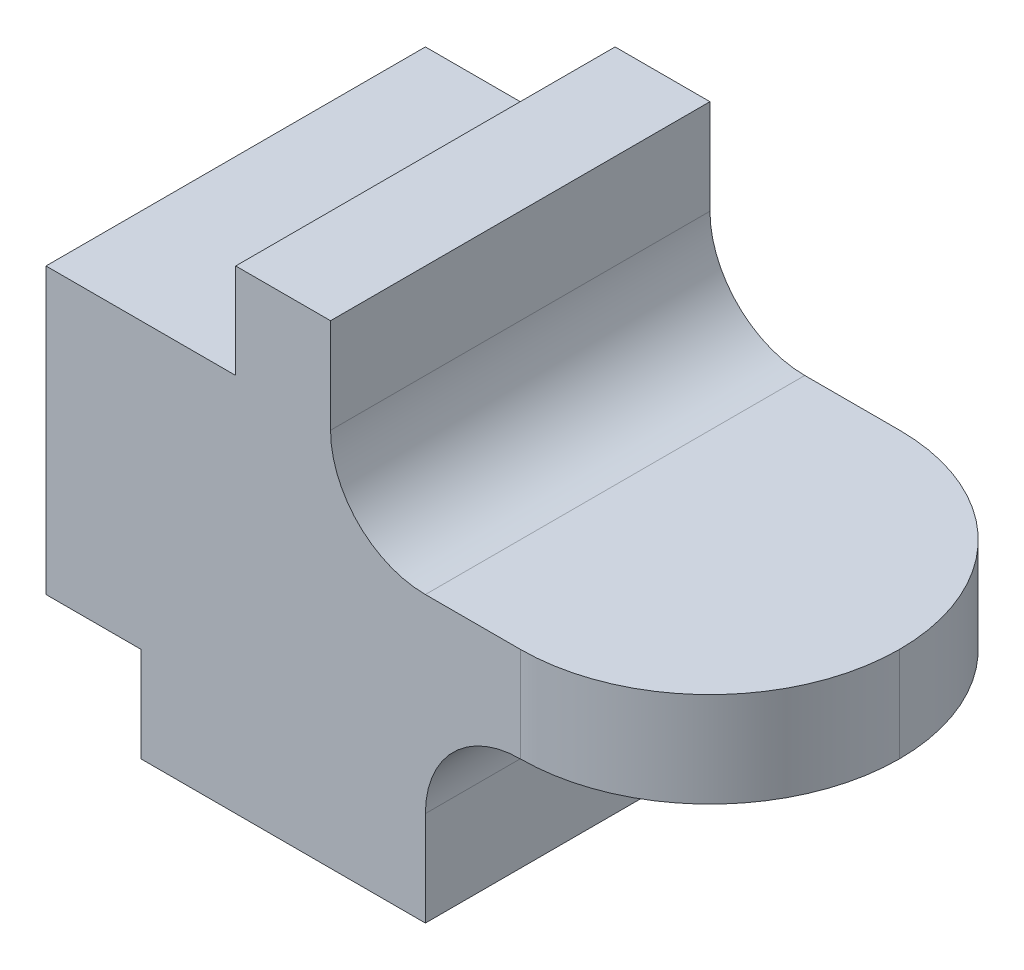
ISO-10303-21;
HEADER;
FILE_DESCRIPTION(('STEP AP214'),'2;1');
FILE_NAME('part.step','',(''),(''),'','','');
FILE_SCHEMA(('AUTOMOTIVE_DESIGN { 1 0 10303 214 1 1 1 1 }'));
ENDSEC;
DATA;
#1=APPLICATION_CONTEXT('core data for automotive mechanical design processes');
#2=APPLICATION_PROTOCOL_DEFINITION('international standard','automotive_design',2000,#1);
#3=PRODUCT_CONTEXT('',#1,'mechanical');
#4=PRODUCT('Part','Part','',(#3));
#5=PRODUCT_RELATED_PRODUCT_CATEGORY('part','',(#4));
#6=PRODUCT_DEFINITION_FORMATION('','',#4);
#7=PRODUCT_DEFINITION_CONTEXT('part definition',#1,'design');
#8=PRODUCT_DEFINITION('design','',#6,#7);
#9=PRODUCT_DEFINITION_SHAPE('','',#8);
#10=(LENGTH_UNIT() NAMED_UNIT(*) SI_UNIT(.MILLI.,.METRE.));
#11=(NAMED_UNIT(*) PLANE_ANGLE_UNIT() SI_UNIT($,.RADIAN.));
#12=(NAMED_UNIT(*) SI_UNIT($,.STERADIAN.) SOLID_ANGLE_UNIT());
#13=UNCERTAINTY_MEASURE_WITH_UNIT(LENGTH_MEASURE(1.E-05),#10,'distance_accuracy_value','');
#14=(GEOMETRIC_REPRESENTATION_CONTEXT(3) GLOBAL_UNCERTAINTY_ASSIGNED_CONTEXT((#13)) GLOBAL_UNIT_ASSIGNED_CONTEXT((#10,
#11,#12)) REPRESENTATION_CONTEXT('',''));
#15=CARTESIAN_POINT('',(0.,0.,0.));
#16=DIRECTION('',(0.,0.,1.));
#17=DIRECTION('',(1.,0.,0.));
#18=AXIS2_PLACEMENT_3D('',#15,#16,#17);
#19=CARTESIAN_POINT('',(5.,0.,20.));
#20=DIRECTION('',(0.,1.,0.));
#21=DIRECTION('',(-1.,0.,0.));
#22=AXIS2_PLACEMENT_3D('',#19,#20,#21);
#23=PLANE('',#22);
#24=DIRECTION('',(1.,0.,0.));
#25=VECTOR('',#24,1.);
#26=CARTESIAN_POINT('',(5.,0.,0.));
#27=LINE('',#26,#25);
#28=CARTESIAN_POINT('',(0.,0.,0.));
#29=VERTEX_POINT('',#28);
#30=CARTESIAN_POINT('',(5.,0.,0.));
#31=VERTEX_POINT('',#30);
#32=EDGE_CURVE('E158',#29,#31,#27,.T.);
#33=ORIENTED_EDGE('',*,*,#32,.T.);
#34=DIRECTION('',(0.,0.,-1.));
#35=VECTOR('',#34,1.);
#36=CARTESIAN_POINT('',(5.,0.,20.));
#37=LINE('',#36,#35);
#38=CARTESIAN_POINT('',(5.,0.,20.));
#39=VERTEX_POINT('',#38);
#40=EDGE_CURVE('E138',#39,#31,#37,.T.);
#41=ORIENTED_EDGE('',*,*,#40,.F.);
#42=DIRECTION('',(1.,0.,0.));
#43=VECTOR('',#42,1.);
#44=CARTESIAN_POINT('',(5.,0.,20.));
#45=LINE('',#44,#43);
#46=CARTESIAN_POINT('',(0.,0.,20.));
#47=VERTEX_POINT('',#46);
#48=EDGE_CURVE('E145',#47,#39,#45,.T.);
#49=ORIENTED_EDGE('',*,*,#48,.F.);
#50=DIRECTION('',(0.,0.,-1.));
#51=VECTOR('',#50,1.);
#52=CARTESIAN_POINT('',(0.,0.,20.));
#53=LINE('',#52,#51);
#54=EDGE_CURVE('E236',#47,#29,#53,.T.);
#55=ORIENTED_EDGE('',*,*,#54,.T.);
#56=EDGE_LOOP('',(#33,#41,#49,#55));
#57=FACE_BOUND('',#56,.T.);
#58=ADVANCED_FACE('F33',(#57),#23,.F.);
#59=CARTESIAN_POINT('',(5.,-5.,20.));
#60=DIRECTION('',(1.,0.,0.));
#61=DIRECTION('',(0.,0.,-1.));
#62=AXIS2_PLACEMENT_3D('',#59,#60,#61);
#63=PLANE('',#62);
#64=DIRECTION('',(0.,-1.,0.));
#65=VECTOR('',#64,1.);
#66=CARTESIAN_POINT('',(5.,-5.,0.));
#67=LINE('',#66,#65);
#68=CARTESIAN_POINT('',(5.,-5.,0.));
#69=VERTEX_POINT('',#68);
#70=EDGE_CURVE('E224',#31,#69,#67,.T.);
#71=ORIENTED_EDGE('',*,*,#70,.T.);
#72=DIRECTION('',(0.,0.,-1.));
#73=VECTOR('',#72,1.);
#74=CARTESIAN_POINT('',(5.,-5.,20.));
#75=LINE('',#74,#73);
#76=CARTESIAN_POINT('',(5.,-5.,20.));
#77=VERTEX_POINT('',#76);
#78=EDGE_CURVE('E141',#77,#69,#75,.T.);
#79=ORIENTED_EDGE('',*,*,#78,.F.);
#80=DIRECTION('',(0.,-1.,0.));
#81=VECTOR('',#80,1.);
#82=CARTESIAN_POINT('',(5.,-5.,20.));
#83=LINE('',#82,#81);
#84=EDGE_CURVE('E134',#39,#77,#83,.T.);
#85=ORIENTED_EDGE('',*,*,#84,.F.);
#86=ORIENTED_EDGE('',*,*,#40,.T.);
#87=EDGE_LOOP('',(#71,#79,#85,#86));
#88=FACE_BOUND('',#87,.T.);
#89=ADVANCED_FACE('F136',(#88),#63,.F.);
#90=CARTESIAN_POINT('',(20.,-5.,20.));
#91=DIRECTION('',(0.,1.,0.));
#92=DIRECTION('',(-1.,0.,0.));
#93=AXIS2_PLACEMENT_3D('',#90,#91,#92);
#94=PLANE('',#93);
#95=DIRECTION('',(1.,0.,0.));
#96=VECTOR('',#95,1.);
#97=CARTESIAN_POINT('',(20.,-5.,0.));
#98=LINE('',#97,#96);
#99=CARTESIAN_POINT('',(20.,-5.,0.));
#100=VERTEX_POINT('',#99);
#101=EDGE_CURVE('E220',#69,#100,#98,.T.);
#102=ORIENTED_EDGE('',*,*,#101,.T.);
#103=DIRECTION('',(0.,0.,-1.));
#104=VECTOR('',#103,1.);
#105=CARTESIAN_POINT('',(20.,-5.,20.));
#106=LINE('',#105,#104);
#107=CARTESIAN_POINT('',(20.,-5.,20.));
#108=VERTEX_POINT('',#107);
#109=EDGE_CURVE('E163',#108,#100,#106,.T.);
#110=ORIENTED_EDGE('',*,*,#109,.F.);
#111=DIRECTION('',(1.,0.,0.));
#112=VECTOR('',#111,1.);
#113=CARTESIAN_POINT('',(20.,-5.,20.));
#114=LINE('',#113,#112);
#115=EDGE_CURVE('E144',#77,#108,#114,.T.);
#116=ORIENTED_EDGE('',*,*,#115,.F.);
#117=ORIENTED_EDGE('',*,*,#78,.T.);
#118=EDGE_LOOP('',(#102,#110,#116,#117));
#119=FACE_BOUND('',#118,.T.);
#120=ADVANCED_FACE('F277',(#119),#94,.F.);
#121=CARTESIAN_POINT('',(20.,5.,20.));
#122=DIRECTION('',(-1.,0.,0.));
#123=DIRECTION('',(0.,0.,1.));
#124=AXIS2_PLACEMENT_3D('',#121,#122,#123);
#125=PLANE('',#124);
#126=DIRECTION('',(0.,1.,0.));
#127=VECTOR('',#126,1.);
#128=CARTESIAN_POINT('',(20.,5.,0.));
#129=LINE('',#128,#127);
#130=CARTESIAN_POINT('',(20.,0.,0.));
#131=VERTEX_POINT('',#130);
#132=EDGE_CURVE('E213',#100,#131,#129,.T.);
#133=ORIENTED_EDGE('',*,*,#132,.T.);
#134=DIRECTION('',(0.,0.,-1.));
#135=VECTOR('',#134,1.);
#136=CARTESIAN_POINT('',(20.,0.,20.));
#137=LINE('',#136,#135);
#138=CARTESIAN_POINT('',(20.,0.,20.));
#139=VERTEX_POINT('',#138);
#140=EDGE_CURVE('E184',#131,#139,#137,.F.);
#141=ORIENTED_EDGE('',*,*,#140,.T.);
#142=DIRECTION('',(0.,1.,0.));
#143=VECTOR('',#142,1.);
#144=CARTESIAN_POINT('',(20.,5.,20.));
#145=LINE('',#144,#143);
#146=EDGE_CURVE('E196',#108,#139,#145,.T.);
#147=ORIENTED_EDGE('',*,*,#146,.F.);
#148=ORIENTED_EDGE('',*,*,#109,.T.);
#149=EDGE_LOOP('',(#133,#141,#147,#148));
#150=FACE_BOUND('',#149,.T.);
#151=ADVANCED_FACE('F217',(#150),#125,.F.);
#152=CARTESIAN_POINT('',(35.,5.,20.));
#153=DIRECTION('',(0.,1.,0.));
#154=DIRECTION('',(-1.,0.,0.));
#155=AXIS2_PLACEMENT_3D('',#152,#153,#154);
#156=PLANE('',#155);
#157=CARTESIAN_POINT('',(25.,5.,10.));
#158=DIRECTION('',(0.,1.,0.));
#159=DIRECTION('',(-1.,0.,0.));
#160=AXIS2_PLACEMENT_3D('',#157,#158,#159);
#161=CIRCLE('',#160,10.);
#162=CARTESIAN_POINT('',(35.,5.,10.));
#163=VERTEX_POINT('',#162);
#164=CARTESIAN_POINT('',(25.,5.,20.));
#165=VERTEX_POINT('',#164);
#166=EDGE_CURVE('E171',#163,#165,#161,.F.);
#167=ORIENTED_EDGE('',*,*,#166,.T.);
#168=DIRECTION('',(0.,0.,-1.));
#169=VECTOR('',#168,1.);
#170=CARTESIAN_POINT('',(25.,5.,0.));
#171=LINE('',#170,#169);
#172=CARTESIAN_POINT('',(25.,5.,0.));
#173=VERTEX_POINT('',#172);
#174=EDGE_CURVE('E178',#165,#173,#171,.T.);
#175=ORIENTED_EDGE('',*,*,#174,.T.);
#176=CARTESIAN_POINT('',(25.,5.,10.));
#177=DIRECTION('',(0.,1.,0.));
#178=DIRECTION('',(-1.,0.,0.));
#179=AXIS2_PLACEMENT_3D('',#176,#177,#178);
#180=CIRCLE('',#179,10.);
#181=EDGE_CURVE('E174',#173,#163,#180,.F.);
#182=ORIENTED_EDGE('',*,*,#181,.T.);
#183=EDGE_LOOP('',(#167,#175,#182));
#184=FACE_BOUND('',#183,.T.);
#185=ADVANCED_FACE('F202',(#184),#156,.F.);
#186=CARTESIAN_POINT('',(15.,10.,20.));
#187=DIRECTION('',(0.,-1.,0.));
#188=DIRECTION('',(0.,0.,-1.));
#189=AXIS2_PLACEMENT_3D('',#186,#187,#188);
#190=PLANE('',#189);
#191=DIRECTION('',(-1.,0.,0.));
#192=VECTOR('',#191,1.);
#193=CARTESIAN_POINT('',(15.,10.,0.));
#194=LINE('',#193,#192);
#195=CARTESIAN_POINT('',(25.,10.,0.));
#196=VERTEX_POINT('',#195);
#197=CARTESIAN_POINT('',(20.,10.,0.));
#198=VERTEX_POINT('',#197);
#199=EDGE_CURVE('E219',#196,#198,#194,.T.);
#200=ORIENTED_EDGE('',*,*,#199,.T.);
#201=DIRECTION('',(0.,0.,-1.));
#202=VECTOR('',#201,1.);
#203=CARTESIAN_POINT('',(20.,10.,20.));
#204=LINE('',#203,#202);
#205=CARTESIAN_POINT('',(20.,10.,20.));
#206=VERTEX_POINT('',#205);
#207=EDGE_CURVE('E48',#198,#206,#204,.F.);
#208=ORIENTED_EDGE('',*,*,#207,.T.);
#209=DIRECTION('',(-1.,0.,0.));
#210=VECTOR('',#209,1.);
#211=CARTESIAN_POINT('',(15.,10.,20.));
#212=LINE('',#211,#210);
#213=CARTESIAN_POINT('',(25.,10.,20.));
#214=VERTEX_POINT('',#213);
#215=EDGE_CURVE('E279',#214,#206,#212,.T.);
#216=ORIENTED_EDGE('',*,*,#215,.F.);
#217=CARTESIAN_POINT('',(25.,10.,10.));
#218=DIRECTION('',(0.,-1.,0.));
#219=DIRECTION('',(0.,0.,-1.));
#220=AXIS2_PLACEMENT_3D('',#217,#218,#219);
#221=CIRCLE('',#220,10.);
#222=CARTESIAN_POINT('',(35.,10.,10.));
#223=VERTEX_POINT('',#222);
#224=EDGE_CURVE('E159',#214,#223,#221,.F.);
#225=ORIENTED_EDGE('',*,*,#224,.T.);
#226=CARTESIAN_POINT('',(25.,10.,10.));
#227=DIRECTION('',(0.,-1.,0.));
#228=DIRECTION('',(0.,0.,-1.));
#229=AXIS2_PLACEMENT_3D('',#226,#227,#228);
#230=CIRCLE('',#229,10.);
#231=EDGE_CURVE('E161',#223,#196,#230,.F.);
#232=ORIENTED_EDGE('',*,*,#231,.T.);
#233=EDGE_LOOP('',(#200,#208,#216,#225,#232));
#234=FACE_BOUND('',#233,.T.);
#235=ADVANCED_FACE('F326',(#234),#190,.F.);
#236=CARTESIAN_POINT('',(15.,20.,20.));
#237=DIRECTION('',(-1.,0.,0.));
#238=DIRECTION('',(0.,-1.,0.));
#239=AXIS2_PLACEMENT_3D('',#236,#237,#238);
#240=PLANE('',#239);
#241=DIRECTION('',(0.,1.,0.));
#242=VECTOR('',#241,1.);
#243=CARTESIAN_POINT('',(15.,20.,20.));
#244=LINE('',#243,#242);
#245=CARTESIAN_POINT('',(15.,15.,20.));
#246=VERTEX_POINT('',#245);
#247=CARTESIAN_POINT('',(15.,20.,20.));
#248=VERTEX_POINT('',#247);
#249=EDGE_CURVE('E283',#246,#248,#244,.T.);
#250=ORIENTED_EDGE('',*,*,#249,.F.);
#251=DIRECTION('',(0.,0.,-1.));
#252=VECTOR('',#251,1.);
#253=CARTESIAN_POINT('',(15.,15.,0.));
#254=LINE('',#253,#252);
#255=CARTESIAN_POINT('',(15.,15.,0.));
#256=VERTEX_POINT('',#255);
#257=EDGE_CURVE('E186',#246,#256,#254,.T.);
#258=ORIENTED_EDGE('',*,*,#257,.T.);
#259=DIRECTION('',(0.,1.,0.));
#260=VECTOR('',#259,1.);
#261=CARTESIAN_POINT('',(15.,20.,0.));
#262=LINE('',#261,#260);
#263=CARTESIAN_POINT('',(15.,20.,0.));
#264=VERTEX_POINT('',#263);
#265=EDGE_CURVE('E222',#256,#264,#262,.T.);
#266=ORIENTED_EDGE('',*,*,#265,.T.);
#267=DIRECTION('',(0.,0.,-1.));
#268=VECTOR('',#267,1.);
#269=CARTESIAN_POINT('',(15.,20.,20.));
#270=LINE('',#269,#268);
#271=EDGE_CURVE('E247',#248,#264,#270,.T.);
#272=ORIENTED_EDGE('',*,*,#271,.F.);
#273=EDGE_LOOP('',(#250,#258,#266,#272));
#274=FACE_BOUND('',#273,.T.);
#275=ADVANCED_FACE('F286',(#274),#240,.F.);
#276=CARTESIAN_POINT('',(10.,20.,20.));
#277=DIRECTION('',(0.,-1.,0.));
#278=DIRECTION('',(1.,0.,0.));
#279=AXIS2_PLACEMENT_3D('',#276,#277,#278);
#280=PLANE('',#279);
#281=DIRECTION('',(-1.,0.,0.));
#282=VECTOR('',#281,1.);
#283=CARTESIAN_POINT('',(10.,20.,0.));
#284=LINE('',#283,#282);
#285=CARTESIAN_POINT('',(10.,20.,0.));
#286=VERTEX_POINT('',#285);
#287=EDGE_CURVE('E229',#264,#286,#284,.T.);
#288=ORIENTED_EDGE('',*,*,#287,.T.);
#289=DIRECTION('',(0.,0.,-1.));
#290=VECTOR('',#289,1.);
#291=CARTESIAN_POINT('',(10.,20.,20.));
#292=LINE('',#291,#290);
#293=CARTESIAN_POINT('',(10.,20.,20.));
#294=VERTEX_POINT('',#293);
#295=EDGE_CURVE('E244',#294,#286,#292,.T.);
#296=ORIENTED_EDGE('',*,*,#295,.F.);
#297=DIRECTION('',(-1.,0.,0.));
#298=VECTOR('',#297,1.);
#299=CARTESIAN_POINT('',(10.,20.,20.));
#300=LINE('',#299,#298);
#301=EDGE_CURVE('E255',#248,#294,#300,.T.);
#302=ORIENTED_EDGE('',*,*,#301,.F.);
#303=ORIENTED_EDGE('',*,*,#271,.T.);
#304=EDGE_LOOP('',(#288,#296,#302,#303));
#305=FACE_BOUND('',#304,.T.);
#306=ADVANCED_FACE('F253',(#305),#280,.F.);
#307=CARTESIAN_POINT('',(9.99999999999999,15.,20.));
#308=DIRECTION('',(1.,0.,0.));
#309=DIRECTION('',(0.,1.,0.));
#310=AXIS2_PLACEMENT_3D('',#307,#308,#309);
#311=PLANE('',#310);
#312=DIRECTION('',(0.,-1.,0.));
#313=VECTOR('',#312,1.);
#314=CARTESIAN_POINT('',(9.99999999999999,15.,0.));
#315=LINE('',#314,#313);
#316=CARTESIAN_POINT('',(9.99999999999999,15.,0.));
#317=VERTEX_POINT('',#316);
#318=EDGE_CURVE('E231',#286,#317,#315,.T.);
#319=ORIENTED_EDGE('',*,*,#318,.T.);
#320=DIRECTION('',(0.,0.,-1.));
#321=VECTOR('',#320,1.);
#322=CARTESIAN_POINT('',(9.99999999999999,15.,20.));
#323=LINE('',#322,#321);
#324=CARTESIAN_POINT('',(9.99999999999999,15.,20.));
#325=VERTEX_POINT('',#324);
#326=EDGE_CURVE('E241',#325,#317,#323,.T.);
#327=ORIENTED_EDGE('',*,*,#326,.F.);
#328=DIRECTION('',(0.,-1.,0.));
#329=VECTOR('',#328,1.);
#330=CARTESIAN_POINT('',(9.99999999999999,15.,20.));
#331=LINE('',#330,#329);
#332=EDGE_CURVE('E270',#294,#325,#331,.T.);
#333=ORIENTED_EDGE('',*,*,#332,.F.);
#334=ORIENTED_EDGE('',*,*,#295,.T.);
#335=EDGE_LOOP('',(#319,#327,#333,#334));
#336=FACE_BOUND('',#335,.T.);
#337=ADVANCED_FACE('F263',(#336),#311,.F.);
#338=CARTESIAN_POINT('',(0.,15.,20.));
#339=DIRECTION('',(0.,-1.,0.));
#340=DIRECTION('',(0.,0.,-1.));
#341=AXIS2_PLACEMENT_3D('',#338,#339,#340);
#342=PLANE('',#341);
#343=DIRECTION('',(-1.,0.,0.));
#344=VECTOR('',#343,1.);
#345=CARTESIAN_POINT('',(0.,15.,0.));
#346=LINE('',#345,#344);
#347=CARTESIAN_POINT('',(0.,15.,0.));
#348=VERTEX_POINT('',#347);
#349=EDGE_CURVE('E233',#317,#348,#346,.T.);
#350=ORIENTED_EDGE('',*,*,#349,.T.);
#351=DIRECTION('',(0.,0.,-1.));
#352=VECTOR('',#351,1.);
#353=CARTESIAN_POINT('',(0.,15.,20.));
#354=LINE('',#353,#352);
#355=CARTESIAN_POINT('',(0.,15.,20.));
#356=VERTEX_POINT('',#355);
#357=EDGE_CURVE('E238',#356,#348,#354,.T.);
#358=ORIENTED_EDGE('',*,*,#357,.F.);
#359=DIRECTION('',(-1.,0.,0.));
#360=VECTOR('',#359,1.);
#361=CARTESIAN_POINT('',(0.,15.,20.));
#362=LINE('',#361,#360);
#363=EDGE_CURVE('E269',#325,#356,#362,.T.);
#364=ORIENTED_EDGE('',*,*,#363,.F.);
#365=ORIENTED_EDGE('',*,*,#326,.T.);
#366=EDGE_LOOP('',(#350,#358,#364,#365));
#367=FACE_BOUND('',#366,.T.);
#368=ADVANCED_FACE('F267',(#367),#342,.F.);
#369=CARTESIAN_POINT('',(0.,0.,20.));
#370=DIRECTION('',(1.,0.,0.));
#371=DIRECTION('',(0.,0.,-1.));
#372=AXIS2_PLACEMENT_3D('',#369,#370,#371);
#373=PLANE('',#372);
#374=DIRECTION('',(0.,-1.,0.));
#375=VECTOR('',#374,1.);
#376=CARTESIAN_POINT('',(0.,0.,0.));
#377=LINE('',#376,#375);
#378=EDGE_CURVE('E155',#348,#29,#377,.T.);
#379=ORIENTED_EDGE('',*,*,#378,.T.);
#380=ORIENTED_EDGE('',*,*,#54,.F.);
#381=DIRECTION('',(0.,-1.,0.));
#382=VECTOR('',#381,1.);
#383=CARTESIAN_POINT('',(0.,0.,20.));
#384=LINE('',#383,#382);
#385=EDGE_CURVE('E151',#356,#47,#384,.T.);
#386=ORIENTED_EDGE('',*,*,#385,.F.);
#387=ORIENTED_EDGE('',*,*,#357,.T.);
#388=EDGE_LOOP('',(#379,#380,#386,#387));
#389=FACE_BOUND('',#388,.T.);
#390=ADVANCED_FACE('F312',(#389),#373,.F.);
#391=CARTESIAN_POINT('',(0.,0.,20.));
#392=DIRECTION('',(0.,0.,-1.));
#393=DIRECTION('',(-1.,0.,0.));
#394=AXIS2_PLACEMENT_3D('',#391,#392,#393);
#395=PLANE('',#394);
#396=ORIENTED_EDGE('',*,*,#146,.T.);
#397=CARTESIAN_POINT('',(25.,0.,20.));
#398=DIRECTION('',(0.,0.,-1.));
#399=DIRECTION('',(-1.,0.,0.));
#400=AXIS2_PLACEMENT_3D('',#397,#398,#399);
#401=CIRCLE('',#400,5.);
#402=EDGE_CURVE('E192',#139,#165,#401,.T.);
#403=ORIENTED_EDGE('',*,*,#402,.T.);
#404=DIRECTION('',(0.,1.,0.));
#405=VECTOR('',#404,1.);
#406=CARTESIAN_POINT('',(25.,0.,20.));
#407=LINE('',#406,#405);
#408=EDGE_CURVE('E176',#165,#214,#407,.T.);
#409=ORIENTED_EDGE('',*,*,#408,.T.);
#410=ORIENTED_EDGE('',*,*,#215,.T.);
#411=CARTESIAN_POINT('',(20.,15.,20.));
#412=DIRECTION('',(0.,0.,-1.));
#413=DIRECTION('',(-1.,0.,0.));
#414=AXIS2_PLACEMENT_3D('',#411,#412,#413);
#415=CIRCLE('',#414,5.);
#416=EDGE_CURVE('E11',#206,#246,#415,.T.);
#417=ORIENTED_EDGE('',*,*,#416,.T.);
#418=ORIENTED_EDGE('',*,*,#249,.T.);
#419=ORIENTED_EDGE('',*,*,#301,.T.);
#420=ORIENTED_EDGE('',*,*,#332,.T.);
#421=ORIENTED_EDGE('',*,*,#363,.T.);
#422=ORIENTED_EDGE('',*,*,#385,.T.);
#423=ORIENTED_EDGE('',*,*,#48,.T.);
#424=ORIENTED_EDGE('',*,*,#84,.T.);
#425=ORIENTED_EDGE('',*,*,#115,.T.);
#426=EDGE_LOOP('',(#396,#403,#409,#410,#417,#418,#419,#420,#421,#422,#423,#424,#425));
#427=FACE_BOUND('',#426,.T.);
#428=ADVANCED_FACE('F149',(#427),#395,.F.);
#429=CARTESIAN_POINT('',(0.,0.,0.));
#430=DIRECTION('',(0.,0.,-1.));
#431=DIRECTION('',(-1.,0.,0.));
#432=AXIS2_PLACEMENT_3D('',#429,#430,#431);
#433=PLANE('',#432);
#434=ORIENTED_EDGE('',*,*,#199,.F.);
#435=DIRECTION('',(0.,1.,0.));
#436=VECTOR('',#435,1.);
#437=CARTESIAN_POINT('',(25.,4.99999999999999,0.));
#438=LINE('',#437,#436);
#439=EDGE_CURVE('E168',#196,#173,#438,.F.);
#440=ORIENTED_EDGE('',*,*,#439,.T.);
#441=CARTESIAN_POINT('',(25.,0.,0.));
#442=DIRECTION('',(0.,0.,-1.));
#443=DIRECTION('',(-1.,0.,0.));
#444=AXIS2_PLACEMENT_3D('',#441,#442,#443);
#445=CIRCLE('',#444,5.);
#446=EDGE_CURVE('E190',#173,#131,#445,.F.);
#447=ORIENTED_EDGE('',*,*,#446,.T.);
#448=ORIENTED_EDGE('',*,*,#132,.F.);
#449=ORIENTED_EDGE('',*,*,#101,.F.);
#450=ORIENTED_EDGE('',*,*,#70,.F.);
#451=ORIENTED_EDGE('',*,*,#32,.F.);
#452=ORIENTED_EDGE('',*,*,#378,.F.);
#453=ORIENTED_EDGE('',*,*,#349,.F.);
#454=ORIENTED_EDGE('',*,*,#318,.F.);
#455=ORIENTED_EDGE('',*,*,#287,.F.);
#456=ORIENTED_EDGE('',*,*,#265,.F.);
#457=CARTESIAN_POINT('',(20.,15.,0.));
#458=DIRECTION('',(0.,0.,-1.));
#459=DIRECTION('',(-1.,0.,0.));
#460=AXIS2_PLACEMENT_3D('',#457,#458,#459);
#461=CIRCLE('',#460,5.);
#462=EDGE_CURVE('E41',#256,#198,#461,.F.);
#463=ORIENTED_EDGE('',*,*,#462,.T.);
#464=EDGE_LOOP('',(#434,#440,#447,#448,#449,#450,#451,#452,#453,#454,#455,#456,#463));
#465=FACE_BOUND('',#464,.T.);
#466=ADVANCED_FACE('F211',(#465),#433,.T.);
#467=CARTESIAN_POINT('',(25.,0.,10.));
#468=DIRECTION('',(0.,1.,0.));
#469=DIRECTION('',(-1.,0.,0.));
#470=AXIS2_PLACEMENT_3D('',#467,#468,#469);
#471=CYLINDRICAL_SURFACE('',#470,10.);
#472=ORIENTED_EDGE('',*,*,#408,.F.);
#473=ORIENTED_EDGE('',*,*,#166,.F.);
#474=DIRECTION('',(0.,1.,0.));
#475=VECTOR('',#474,1.);
#476=CARTESIAN_POINT('',(35.,10.,10.));
#477=LINE('',#476,#475);
#478=EDGE_CURVE('E179',#223,#163,#477,.F.);
#479=ORIENTED_EDGE('',*,*,#478,.F.);
#480=ORIENTED_EDGE('',*,*,#224,.F.);
#481=EDGE_LOOP('',(#472,#473,#479,#480));
#482=FACE_BOUND('',#481,.T.);
#483=ADVANCED_FACE('F207',(#482),#471,.T.);
#484=CARTESIAN_POINT('',(25.,9.99999999999999,10.));
#485=DIRECTION('',(0.,-1.,0.));
#486=DIRECTION('',(1.,0.,0.));
#487=AXIS2_PLACEMENT_3D('',#484,#485,#486);
#488=CYLINDRICAL_SURFACE('',#487,10.);
#489=ORIENTED_EDGE('',*,*,#181,.F.);
#490=ORIENTED_EDGE('',*,*,#439,.F.);
#491=ORIENTED_EDGE('',*,*,#231,.F.);
#492=ORIENTED_EDGE('',*,*,#478,.T.);
#493=EDGE_LOOP('',(#489,#490,#491,#492));
#494=FACE_BOUND('',#493,.T.);
#495=ADVANCED_FACE('F292',(#494),#488,.T.);
#496=CARTESIAN_POINT('',(25.,0.,20.));
#497=DIRECTION('',(0.,0.,1.));
#498=DIRECTION('',(1.,0.,0.));
#499=AXIS2_PLACEMENT_3D('',#496,#497,#498);
#500=CYLINDRICAL_SURFACE('',#499,5.);
#501=ORIENTED_EDGE('',*,*,#402,.F.);
#502=ORIENTED_EDGE('',*,*,#140,.F.);
#503=ORIENTED_EDGE('',*,*,#446,.F.);
#504=ORIENTED_EDGE('',*,*,#174,.F.);
#505=EDGE_LOOP('',(#501,#502,#503,#504));
#506=FACE_BOUND('',#505,.T.);
#507=ADVANCED_FACE('F208',(#506),#500,.F.);
#508=CARTESIAN_POINT('',(20.,15.,20.));
#509=DIRECTION('',(0.,0.,1.));
#510=DIRECTION('',(1.,0.,0.));
#511=AXIS2_PLACEMENT_3D('',#508,#509,#510);
#512=CYLINDRICAL_SURFACE('',#511,5.);
#513=ORIENTED_EDGE('',*,*,#416,.F.);
#514=ORIENTED_EDGE('',*,*,#207,.F.);
#515=ORIENTED_EDGE('',*,*,#462,.F.);
#516=ORIENTED_EDGE('',*,*,#257,.F.);
#517=EDGE_LOOP('',(#513,#514,#515,#516));
#518=FACE_BOUND('',#517,.T.);
#519=ADVANCED_FACE('F35',(#518),#512,.F.);
#520=CLOSED_SHELL('',(#58,#89,#120,#151,#185,#235,#275,#306,#337,#368,#390,#428,#466,#483,#495,
#507,#519));
#521=MANIFOLD_SOLID_BREP('B2',#520);
#522=ADVANCED_BREP_SHAPE_REPRESENTATION('',(#18,#521),#14);
#523=SHAPE_DEFINITION_REPRESENTATION(#9,#522);
ENDSEC;
END-ISO-10303-21;
